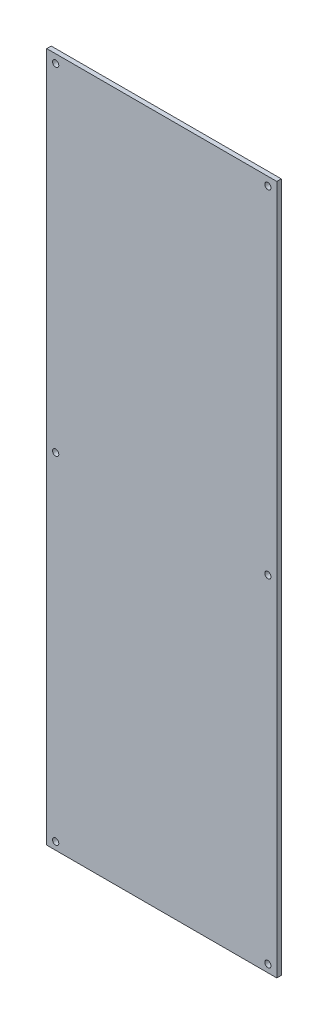
ISO-10303-21;
HEADER;
FILE_DESCRIPTION(('STEP AP214'),'2;1');
FILE_NAME('part.step','',(''),(''),'','','');
FILE_SCHEMA(('AUTOMOTIVE_DESIGN { 1 0 10303 214 1 1 1 1 }'));
ENDSEC;
DATA;
#1=APPLICATION_CONTEXT('core data for automotive mechanical design processes');
#2=APPLICATION_PROTOCOL_DEFINITION('international standard','automotive_design',2000,#1);
#3=PRODUCT_CONTEXT('',#1,'mechanical');
#4=PRODUCT('Part','Part','',(#3));
#5=PRODUCT_RELATED_PRODUCT_CATEGORY('part','',(#4));
#6=PRODUCT_DEFINITION_FORMATION('','',#4);
#7=PRODUCT_DEFINITION_CONTEXT('part definition',#1,'design');
#8=PRODUCT_DEFINITION('design','',#6,#7);
#9=PRODUCT_DEFINITION_SHAPE('','',#8);
#10=(LENGTH_UNIT() NAMED_UNIT(*) SI_UNIT(.MILLI.,.METRE.));
#11=(NAMED_UNIT(*) PLANE_ANGLE_UNIT() SI_UNIT($,.RADIAN.));
#12=(NAMED_UNIT(*) SI_UNIT($,.STERADIAN.) SOLID_ANGLE_UNIT());
#13=UNCERTAINTY_MEASURE_WITH_UNIT(LENGTH_MEASURE(1.E-05),#10,'distance_accuracy_value','');
#14=(GEOMETRIC_REPRESENTATION_CONTEXT(3) GLOBAL_UNCERTAINTY_ASSIGNED_CONTEXT((#13)) GLOBAL_UNIT_ASSIGNED_CONTEXT((#10,
#11,#12)) REPRESENTATION_CONTEXT('',''));
#15=CARTESIAN_POINT('',(0.,0.,0.));
#16=DIRECTION('',(0.,0.,1.));
#17=DIRECTION('',(1.,0.,0.));
#18=AXIS2_PLACEMENT_3D('',#15,#16,#17);
#19=CARTESIAN_POINT('',(0.,0.,0.));
#20=DIRECTION('',(0.,0.,-1.));
#21=DIRECTION('',(-1.,0.,0.));
#22=AXIS2_PLACEMENT_3D('',#19,#20,#21);
#23=PLANE('',#22);
#24=CARTESIAN_POINT('',(-138.750000000001,376.500000000001,0.));
#25=DIRECTION('',(0.,0.,-1.));
#26=DIRECTION('',(-1.,0.,0.));
#27=AXIS2_PLACEMENT_3D('',#24,#25,#26);
#28=CIRCLE('',#27,3.50000000000001);
#29=CARTESIAN_POINT('',(-142.250000000001,376.500000000001,0.));
#30=VERTEX_POINT('',#29);
#31=EDGE_CURVE('E133',#30,#30,#28,.T.);
#32=ORIENTED_EDGE('',*,*,#31,.F.);
#33=EDGE_LOOP('',(#32));
#34=FACE_BOUND('',#33,.T.);
#35=CARTESIAN_POINT('',(98.7500000000001,-0.499999999999778,0.));
#36=DIRECTION('',(0.,0.,-1.));
#37=DIRECTION('',(-1.,0.,0.));
#38=AXIS2_PLACEMENT_3D('',#35,#36,#37);
#39=CIRCLE('',#38,3.50000000000001);
#40=CARTESIAN_POINT('',(95.2500000000001,-0.499999999999778,0.));
#41=VERTEX_POINT('',#40);
#42=EDGE_CURVE('E137',#41,#41,#39,.T.);
#43=ORIENTED_EDGE('',*,*,#42,.F.);
#44=EDGE_LOOP('',(#43));
#45=FACE_BOUND('',#44,.T.);
#46=CARTESIAN_POINT('',(-138.75,-0.499999999999612,0.));
#47=DIRECTION('',(0.,0.,-1.));
#48=DIRECTION('',(-1.,0.,0.));
#49=AXIS2_PLACEMENT_3D('',#46,#47,#48);
#50=CIRCLE('',#49,3.50000000000001);
#51=CARTESIAN_POINT('',(-142.25,-0.499999999999612,0.));
#52=VERTEX_POINT('',#51);
#53=EDGE_CURVE('E142',#52,#52,#50,.T.);
#54=ORIENTED_EDGE('',*,*,#53,.F.);
#55=EDGE_LOOP('',(#54));
#56=FACE_BOUND('',#55,.T.);
#57=CARTESIAN_POINT('',(98.7499999999998,-377.5,0.));
#58=DIRECTION('',(0.,0.,-1.));
#59=DIRECTION('',(-1.,0.,0.));
#60=AXIS2_PLACEMENT_3D('',#57,#58,#59);
#61=CIRCLE('',#60,3.50000000000001);
#62=CARTESIAN_POINT('',(95.2499999999998,-377.5,0.));
#63=VERTEX_POINT('',#62);
#64=EDGE_CURVE('E146',#63,#63,#61,.T.);
#65=ORIENTED_EDGE('',*,*,#64,.F.);
#66=EDGE_LOOP('',(#65));
#67=FACE_BOUND('',#66,.T.);
#68=CARTESIAN_POINT('',(98.7500000000004,376.5,0.));
#69=DIRECTION('',(0.,0.,-1.));
#70=DIRECTION('',(-1.,0.,0.));
#71=AXIS2_PLACEMENT_3D('',#68,#69,#70);
#72=CIRCLE('',#71,3.50000000000001);
#73=CARTESIAN_POINT('',(95.2500000000004,376.5,0.));
#74=VERTEX_POINT('',#73);
#75=EDGE_CURVE('E138',#74,#74,#72,.T.);
#76=ORIENTED_EDGE('',*,*,#75,.F.);
#77=EDGE_LOOP('',(#76));
#78=FACE_BOUND('',#77,.T.);
#79=CARTESIAN_POINT('',(-138.75,-377.5,0.));
#80=DIRECTION('',(0.,0.,-1.));
#81=DIRECTION('',(-1.,0.,0.));
#82=AXIS2_PLACEMENT_3D('',#79,#80,#81);
#83=CIRCLE('',#82,3.50000000000001);
#84=CARTESIAN_POINT('',(-142.25,-377.5,0.));
#85=VERTEX_POINT('',#84);
#86=EDGE_CURVE('E149',#85,#85,#83,.T.);
#87=ORIENTED_EDGE('',*,*,#86,.F.);
#88=EDGE_LOOP('',(#87));
#89=FACE_BOUND('',#88,.T.);
#90=DIRECTION('',(-1.,0.,0.));
#91=VECTOR('',#90,1.);
#92=CARTESIAN_POINT('',(-108.75,386.,0.));
#93=LINE('',#92,#91);
#94=CARTESIAN_POINT('',(108.75,386.,0.));
#95=VERTEX_POINT('',#94);
#96=CARTESIAN_POINT('',(-148.75,386.,0.));
#97=VERTEX_POINT('',#96);
#98=EDGE_CURVE('E105',#95,#97,#93,.T.);
#99=ORIENTED_EDGE('',*,*,#98,.F.);
#100=DIRECTION('',(0.,1.,0.));
#101=VECTOR('',#100,1.);
#102=CARTESIAN_POINT('',(108.75,-386.,0.));
#103=LINE('',#102,#101);
#104=CARTESIAN_POINT('',(108.75,-386.,0.));
#105=VERTEX_POINT('',#104);
#106=EDGE_CURVE('E66',#105,#95,#103,.T.);
#107=ORIENTED_EDGE('',*,*,#106,.F.);
#108=DIRECTION('',(1.,0.,0.));
#109=VECTOR('',#108,1.);
#110=CARTESIAN_POINT('',(-108.75,-386.,0.));
#111=LINE('',#110,#109);
#112=CARTESIAN_POINT('',(-148.75,-386.,0.));
#113=VERTEX_POINT('',#112);
#114=EDGE_CURVE('E88',#113,#105,#111,.T.);
#115=ORIENTED_EDGE('',*,*,#114,.F.);
#116=DIRECTION('',(0.,-1.,0.));
#117=VECTOR('',#116,1.);
#118=CARTESIAN_POINT('',(-148.75,-386.,0.));
#119=LINE('',#118,#117);
#120=EDGE_CURVE('E128',#97,#113,#119,.T.);
#121=ORIENTED_EDGE('',*,*,#120,.F.);
#122=EDGE_LOOP('',(#99,#107,#115,#121));
#123=FACE_BOUND('',#122,.T.);
#124=ADVANCED_FACE('F39',(#34,#45,#56,#67,#78,#89,#123),#23,.T.);
#125=CARTESIAN_POINT('',(108.75,-386.,0.));
#126=DIRECTION('',(1.,0.,0.));
#127=DIRECTION('',(0.,0.,-1.));
#128=AXIS2_PLACEMENT_3D('',#125,#126,#127);
#129=PLANE('',#128);
#130=DIRECTION('',(0.,1.,0.));
#131=VECTOR('',#130,1.);
#132=CARTESIAN_POINT('',(108.75,-386.,5.));
#133=LINE('',#132,#131);
#134=CARTESIAN_POINT('',(108.75,-386.,5.));
#135=VERTEX_POINT('',#134);
#136=CARTESIAN_POINT('',(108.75,386.,5.));
#137=VERTEX_POINT('',#136);
#138=EDGE_CURVE('E90',#135,#137,#133,.T.);
#139=ORIENTED_EDGE('',*,*,#138,.F.);
#140=DIRECTION('',(0.,0.,1.));
#141=VECTOR('',#140,1.);
#142=CARTESIAN_POINT('',(108.75,-386.,0.));
#143=LINE('',#142,#141);
#144=EDGE_CURVE('E12',#105,#135,#143,.T.);
#145=ORIENTED_EDGE('',*,*,#144,.F.);
#146=ORIENTED_EDGE('',*,*,#106,.T.);
#147=DIRECTION('',(0.,0.,1.));
#148=VECTOR('',#147,1.);
#149=CARTESIAN_POINT('',(108.75,386.,0.));
#150=LINE('',#149,#148);
#151=EDGE_CURVE('E92',#95,#137,#150,.T.);
#152=ORIENTED_EDGE('',*,*,#151,.T.);
#153=EDGE_LOOP('',(#139,#145,#146,#152));
#154=FACE_BOUND('',#153,.T.);
#155=ADVANCED_FACE('F91',(#154),#129,.T.);
#156=CARTESIAN_POINT('',(-108.75,-386.,0.));
#157=DIRECTION('',(0.,-1.,0.));
#158=DIRECTION('',(0.,0.,-1.));
#159=AXIS2_PLACEMENT_3D('',#156,#157,#158);
#160=PLANE('',#159);
#161=DIRECTION('',(1.,0.,0.));
#162=VECTOR('',#161,1.);
#163=CARTESIAN_POINT('',(-108.75,-386.,5.));
#164=LINE('',#163,#162);
#165=CARTESIAN_POINT('',(-148.75,-386.,5.));
#166=VERTEX_POINT('',#165);
#167=EDGE_CURVE('E86',#166,#135,#164,.T.);
#168=ORIENTED_EDGE('',*,*,#167,.F.);
#169=DIRECTION('',(0.,0.,1.));
#170=VECTOR('',#169,1.);
#171=CARTESIAN_POINT('',(-148.75,-386.,0.));
#172=LINE('',#171,#170);
#173=EDGE_CURVE('E49',#113,#166,#172,.T.);
#174=ORIENTED_EDGE('',*,*,#173,.F.);
#175=ORIENTED_EDGE('',*,*,#114,.T.);
#176=ORIENTED_EDGE('',*,*,#144,.T.);
#177=EDGE_LOOP('',(#168,#174,#175,#176));
#178=FACE_BOUND('',#177,.T.);
#179=ADVANCED_FACE('F84',(#178),#160,.T.);
#180=CARTESIAN_POINT('',(-148.75,-386.,0.));
#181=DIRECTION('',(-1.,0.,0.));
#182=DIRECTION('',(0.,0.,1.));
#183=AXIS2_PLACEMENT_3D('',#180,#181,#182);
#184=PLANE('',#183);
#185=DIRECTION('',(0.,-1.,0.));
#186=VECTOR('',#185,1.);
#187=CARTESIAN_POINT('',(-148.75,-386.,5.));
#188=LINE('',#187,#186);
#189=CARTESIAN_POINT('',(-148.75,386.,5.));
#190=VERTEX_POINT('',#189);
#191=EDGE_CURVE('E57',#190,#166,#188,.T.);
#192=ORIENTED_EDGE('',*,*,#191,.F.);
#193=DIRECTION('',(0.,0.,1.));
#194=VECTOR('',#193,1.);
#195=CARTESIAN_POINT('',(-148.75,386.,0.));
#196=LINE('',#195,#194);
#197=EDGE_CURVE('E112',#97,#190,#196,.T.);
#198=ORIENTED_EDGE('',*,*,#197,.F.);
#199=ORIENTED_EDGE('',*,*,#120,.T.);
#200=ORIENTED_EDGE('',*,*,#173,.T.);
#201=EDGE_LOOP('',(#192,#198,#199,#200));
#202=FACE_BOUND('',#201,.T.);
#203=ADVANCED_FACE('F173',(#202),#184,.T.);
#204=CARTESIAN_POINT('',(-108.75,386.,0.));
#205=DIRECTION('',(0.,1.,0.));
#206=DIRECTION('',(0.,0.,1.));
#207=AXIS2_PLACEMENT_3D('',#204,#205,#206);
#208=PLANE('',#207);
#209=DIRECTION('',(-1.,0.,0.));
#210=VECTOR('',#209,1.);
#211=CARTESIAN_POINT('',(-108.75,386.,5.));
#212=LINE('',#211,#210);
#213=EDGE_CURVE('E97',#137,#190,#212,.T.);
#214=ORIENTED_EDGE('',*,*,#213,.F.);
#215=ORIENTED_EDGE('',*,*,#151,.F.);
#216=ORIENTED_EDGE('',*,*,#98,.T.);
#217=ORIENTED_EDGE('',*,*,#197,.T.);
#218=EDGE_LOOP('',(#214,#215,#216,#217));
#219=FACE_BOUND('',#218,.T.);
#220=ADVANCED_FACE('F171',(#219),#208,.T.);
#221=CARTESIAN_POINT('',(0.,0.,5.));
#222=DIRECTION('',(0.,0.,-1.));
#223=DIRECTION('',(-1.,0.,0.));
#224=AXIS2_PLACEMENT_3D('',#221,#222,#223);
#225=PLANE('',#224);
#226=CARTESIAN_POINT('',(-138.750000000001,376.500000000001,5.));
#227=DIRECTION('',(0.,0.,-1.));
#228=DIRECTION('',(-1.,0.,0.));
#229=AXIS2_PLACEMENT_3D('',#226,#227,#228);
#230=CIRCLE('',#229,3.50000000000001);
#231=CARTESIAN_POINT('',(-142.250000000001,376.500000000001,5.));
#232=VERTEX_POINT('',#231);
#233=EDGE_CURVE('E98',#232,#232,#230,.T.);
#234=ORIENTED_EDGE('',*,*,#233,.T.);
#235=EDGE_LOOP('',(#234));
#236=FACE_BOUND('',#235,.T.);
#237=CARTESIAN_POINT('',(98.7500000000001,-0.499999999999778,5.));
#238=DIRECTION('',(0.,0.,-1.));
#239=DIRECTION('',(-1.,0.,0.));
#240=AXIS2_PLACEMENT_3D('',#237,#238,#239);
#241=CIRCLE('',#240,3.50000000000001);
#242=CARTESIAN_POINT('',(95.2500000000001,-0.499999999999778,5.));
#243=VERTEX_POINT('',#242);
#244=EDGE_CURVE('E122',#243,#243,#241,.T.);
#245=ORIENTED_EDGE('',*,*,#244,.T.);
#246=EDGE_LOOP('',(#245));
#247=FACE_BOUND('',#246,.T.);
#248=CARTESIAN_POINT('',(-138.75,-0.499999999999612,5.));
#249=DIRECTION('',(0.,0.,-1.));
#250=DIRECTION('',(-1.,0.,0.));
#251=AXIS2_PLACEMENT_3D('',#248,#249,#250);
#252=CIRCLE('',#251,3.50000000000001);
#253=CARTESIAN_POINT('',(-142.25,-0.499999999999612,5.));
#254=VERTEX_POINT('',#253);
#255=EDGE_CURVE('E121',#254,#254,#252,.T.);
#256=ORIENTED_EDGE('',*,*,#255,.T.);
#257=EDGE_LOOP('',(#256));
#258=FACE_BOUND('',#257,.T.);
#259=CARTESIAN_POINT('',(98.7499999999998,-377.5,5.));
#260=DIRECTION('',(0.,0.,-1.));
#261=DIRECTION('',(-1.,0.,0.));
#262=AXIS2_PLACEMENT_3D('',#259,#260,#261);
#263=CIRCLE('',#262,3.50000000000001);
#264=CARTESIAN_POINT('',(95.2499999999998,-377.5,5.));
#265=VERTEX_POINT('',#264);
#266=EDGE_CURVE('E117',#265,#265,#263,.T.);
#267=ORIENTED_EDGE('',*,*,#266,.T.);
#268=EDGE_LOOP('',(#267));
#269=FACE_BOUND('',#268,.T.);
#270=CARTESIAN_POINT('',(98.7500000000004,376.5,5.));
#271=DIRECTION('',(0.,0.,-1.));
#272=DIRECTION('',(-1.,0.,0.));
#273=AXIS2_PLACEMENT_3D('',#270,#271,#272);
#274=CIRCLE('',#273,3.50000000000001);
#275=CARTESIAN_POINT('',(95.2500000000004,376.5,5.));
#276=VERTEX_POINT('',#275);
#277=EDGE_CURVE('E113',#276,#276,#274,.T.);
#278=ORIENTED_EDGE('',*,*,#277,.T.);
#279=EDGE_LOOP('',(#278));
#280=FACE_BOUND('',#279,.T.);
#281=CARTESIAN_POINT('',(-138.75,-377.5,5.));
#282=DIRECTION('',(0.,0.,-1.));
#283=DIRECTION('',(-1.,0.,0.));
#284=AXIS2_PLACEMENT_3D('',#281,#282,#283);
#285=CIRCLE('',#284,3.50000000000001);
#286=CARTESIAN_POINT('',(-142.25,-377.5,5.));
#287=VERTEX_POINT('',#286);
#288=EDGE_CURVE('E43',#287,#287,#285,.T.);
#289=ORIENTED_EDGE('',*,*,#288,.T.);
#290=EDGE_LOOP('',(#289));
#291=FACE_BOUND('',#290,.T.);
#292=ORIENTED_EDGE('',*,*,#138,.T.);
#293=ORIENTED_EDGE('',*,*,#213,.T.);
#294=ORIENTED_EDGE('',*,*,#191,.T.);
#295=ORIENTED_EDGE('',*,*,#167,.T.);
#296=EDGE_LOOP('',(#292,#293,#294,#295));
#297=FACE_BOUND('',#296,.T.);
#298=ADVANCED_FACE('F100',(#236,#247,#258,#269,#280,#291,#297),#225,.F.);
#299=CARTESIAN_POINT('',(-138.75,-377.5,10.));
#300=DIRECTION('',(0.,0.,-1.));
#301=DIRECTION('',(-1.,0.,0.));
#302=AXIS2_PLACEMENT_3D('',#299,#300,#301);
#303=CYLINDRICAL_SURFACE('',#302,3.50000000000001);
#304=ORIENTED_EDGE('',*,*,#86,.T.);
#305=EDGE_LOOP('',(#304));
#306=FACE_BOUND('',#305,.T.);
#307=ORIENTED_EDGE('',*,*,#288,.F.);
#308=EDGE_LOOP('',(#307));
#309=FACE_BOUND('',#308,.T.);
#310=ADVANCED_FACE('F194',(#306,#309),#303,.F.);
#311=CARTESIAN_POINT('',(98.7500000000004,376.5,10.));
#312=DIRECTION('',(0.,0.,-1.));
#313=DIRECTION('',(-1.,0.,0.));
#314=AXIS2_PLACEMENT_3D('',#311,#312,#313);
#315=CYLINDRICAL_SURFACE('',#314,3.50000000000001);
#316=ORIENTED_EDGE('',*,*,#75,.T.);
#317=EDGE_LOOP('',(#316));
#318=FACE_BOUND('',#317,.T.);
#319=ORIENTED_EDGE('',*,*,#277,.F.);
#320=EDGE_LOOP('',(#319));
#321=FACE_BOUND('',#320,.T.);
#322=ADVANCED_FACE('F201',(#318,#321),#315,.F.);
#323=CARTESIAN_POINT('',(98.7499999999998,-377.5,10.));
#324=DIRECTION('',(0.,0.,-1.));
#325=DIRECTION('',(-1.,0.,0.));
#326=AXIS2_PLACEMENT_3D('',#323,#324,#325);
#327=CYLINDRICAL_SURFACE('',#326,3.50000000000001);
#328=ORIENTED_EDGE('',*,*,#64,.T.);
#329=EDGE_LOOP('',(#328));
#330=FACE_BOUND('',#329,.T.);
#331=ORIENTED_EDGE('',*,*,#266,.F.);
#332=EDGE_LOOP('',(#331));
#333=FACE_BOUND('',#332,.T.);
#334=ADVANCED_FACE('F197',(#330,#333),#327,.F.);
#335=CARTESIAN_POINT('',(-138.75,-0.499999999999612,10.));
#336=DIRECTION('',(0.,0.,-1.));
#337=DIRECTION('',(-1.,0.,0.));
#338=AXIS2_PLACEMENT_3D('',#335,#336,#337);
#339=CYLINDRICAL_SURFACE('',#338,3.50000000000001);
#340=ORIENTED_EDGE('',*,*,#53,.T.);
#341=EDGE_LOOP('',(#340));
#342=FACE_BOUND('',#341,.T.);
#343=ORIENTED_EDGE('',*,*,#255,.F.);
#344=EDGE_LOOP('',(#343));
#345=FACE_BOUND('',#344,.T.);
#346=ADVANCED_FACE('F200',(#342,#345),#339,.F.);
#347=CARTESIAN_POINT('',(98.7500000000001,-0.499999999999778,10.));
#348=DIRECTION('',(0.,0.,-1.));
#349=DIRECTION('',(-1.,0.,0.));
#350=AXIS2_PLACEMENT_3D('',#347,#348,#349);
#351=CYLINDRICAL_SURFACE('',#350,3.50000000000001);
#352=ORIENTED_EDGE('',*,*,#42,.T.);
#353=EDGE_LOOP('',(#352));
#354=FACE_BOUND('',#353,.T.);
#355=ORIENTED_EDGE('',*,*,#244,.F.);
#356=EDGE_LOOP('',(#355));
#357=FACE_BOUND('',#356,.T.);
#358=ADVANCED_FACE('F202',(#354,#357),#351,.F.);
#359=CARTESIAN_POINT('',(-138.750000000001,376.500000000001,10.));
#360=DIRECTION('',(0.,0.,-1.));
#361=DIRECTION('',(-1.,0.,0.));
#362=AXIS2_PLACEMENT_3D('',#359,#360,#361);
#363=CYLINDRICAL_SURFACE('',#362,3.50000000000001);
#364=ORIENTED_EDGE('',*,*,#31,.T.);
#365=EDGE_LOOP('',(#364));
#366=FACE_BOUND('',#365,.T.);
#367=ORIENTED_EDGE('',*,*,#233,.F.);
#368=EDGE_LOOP('',(#367));
#369=FACE_BOUND('',#368,.T.);
#370=ADVANCED_FACE('F41',(#366,#369),#363,.F.);
#371=CLOSED_SHELL('',(#124,#155,#179,#203,#220,#298,#310,#322,#334,#346,#358,#370));
#372=MANIFOLD_SOLID_BREP('B2',#371);
#373=ADVANCED_BREP_SHAPE_REPRESENTATION('',(#18,#372),#14);
#374=SHAPE_DEFINITION_REPRESENTATION(#9,#373);
ENDSEC;
END-ISO-10303-21;
